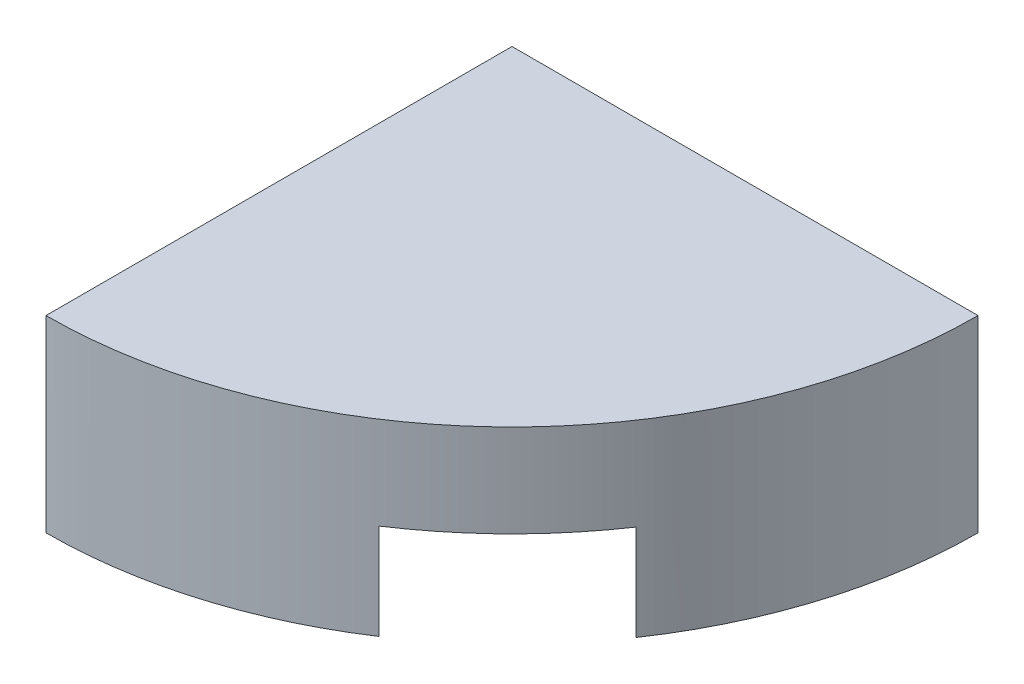
ISO-10303-21;
HEADER;
FILE_DESCRIPTION(('STEP AP214'),'2;1');
FILE_NAME('part.step','',(''),(''),'','','');
FILE_SCHEMA(('AUTOMOTIVE_DESIGN { 1 0 10303 214 1 1 1 1 }'));
ENDSEC;
DATA;
#1=APPLICATION_CONTEXT('core data for automotive mechanical design processes');
#2=APPLICATION_PROTOCOL_DEFINITION('international standard','automotive_design',2000,#1);
#3=PRODUCT_CONTEXT('',#1,'mechanical');
#4=PRODUCT('Part','Part','',(#3));
#5=PRODUCT_RELATED_PRODUCT_CATEGORY('part','',(#4));
#6=PRODUCT_DEFINITION_FORMATION('','',#4);
#7=PRODUCT_DEFINITION_CONTEXT('part definition',#1,'design');
#8=PRODUCT_DEFINITION('design','',#6,#7);
#9=PRODUCT_DEFINITION_SHAPE('','',#8);
#10=(LENGTH_UNIT() NAMED_UNIT(*) SI_UNIT(.MILLI.,.METRE.));
#11=(NAMED_UNIT(*) PLANE_ANGLE_UNIT() SI_UNIT($,.RADIAN.));
#12=(NAMED_UNIT(*) SI_UNIT($,.STERADIAN.) SOLID_ANGLE_UNIT());
#13=UNCERTAINTY_MEASURE_WITH_UNIT(LENGTH_MEASURE(1.E-05),#10,'distance_accuracy_value','');
#14=(GEOMETRIC_REPRESENTATION_CONTEXT(3) GLOBAL_UNCERTAINTY_ASSIGNED_CONTEXT((#13)) GLOBAL_UNIT_ASSIGNED_CONTEXT((#10,
#11,#12)) REPRESENTATION_CONTEXT('',''));
#15=CARTESIAN_POINT('',(0.,0.,0.));
#16=DIRECTION('',(0.,0.,1.));
#17=DIRECTION('',(1.,0.,0.));
#18=AXIS2_PLACEMENT_3D('',#15,#16,#17);
#19=CARTESIAN_POINT('',(0.,-3.15,0.));
#20=DIRECTION('',(0.,1.,0.));
#21=DIRECTION('',(0.,0.,1.));
#22=AXIS2_PLACEMENT_3D('',#19,#20,#21);
#23=CYLINDRICAL_SURFACE('',#22,7.8);
#24=CARTESIAN_POINT('',(0.,-1.55,0.));
#25=DIRECTION('',(0.,-1.,0.));
#26=DIRECTION('',(0.,0.,-1.));
#27=AXIS2_PLACEMENT_3D('',#24,#25,#26);
#28=CIRCLE('',#27,7.8);
#29=CARTESIAN_POINT('',(4.28874587097361,-1.55,6.51511004160381));
#30=VERTEX_POINT('',#29);
#31=CARTESIAN_POINT('',(6.45391788949066,-1.55,4.38029038714472));
#32=VERTEX_POINT('',#31);
#33=EDGE_CURVE('E183',#30,#32,#28,.F.);
#34=ORIENTED_EDGE('',*,*,#33,.T.);
#35=DIRECTION('',(0.,1.,0.));
#36=VECTOR('',#35,1.);
#37=CARTESIAN_POINT('',(6.45391788949066,-2.35,4.38029038714472));
#38=LINE('',#37,#36);
#39=CARTESIAN_POINT('',(6.45391788949066,-3.15,4.38029038714472));
#40=VERTEX_POINT('',#39);
#41=EDGE_CURVE('E116',#32,#40,#38,.F.);
#42=ORIENTED_EDGE('',*,*,#41,.T.);
#43=CARTESIAN_POINT('',(0.,-3.15,0.));
#44=DIRECTION('',(0.,1.,0.));
#45=DIRECTION('',(0.,0.,1.));
#46=AXIS2_PLACEMENT_3D('',#43,#44,#45);
#47=CIRCLE('',#46,7.8);
#48=CARTESIAN_POINT('',(7.8,-3.15,0.));
#49=VERTEX_POINT('',#48);
#50=EDGE_CURVE('E131',#40,#49,#47,.T.);
#51=ORIENTED_EDGE('',*,*,#50,.T.);
#52=DIRECTION('',(0.,1.,0.));
#53=VECTOR('',#52,1.);
#54=CARTESIAN_POINT('',(7.8,-3.15,0.));
#55=LINE('',#54,#53);
#56=CARTESIAN_POINT('',(7.8,0.,0.));
#57=VERTEX_POINT('',#56);
#58=EDGE_CURVE('E11',#49,#57,#55,.T.);
#59=ORIENTED_EDGE('',*,*,#58,.T.);
#60=CARTESIAN_POINT('',(0.,0.,0.));
#61=DIRECTION('',(0.,1.,0.));
#62=DIRECTION('',(0.,0.,1.));
#63=AXIS2_PLACEMENT_3D('',#60,#61,#62);
#64=CIRCLE('',#63,7.8);
#65=CARTESIAN_POINT('',(0.,0.,7.8));
#66=VERTEX_POINT('',#65);
#67=EDGE_CURVE('E144',#66,#57,#64,.T.);
#68=ORIENTED_EDGE('',*,*,#67,.F.);
#69=DIRECTION('',(0.,1.,0.));
#70=VECTOR('',#69,1.);
#71=CARTESIAN_POINT('',(0.,-3.15,7.8));
#72=LINE('',#71,#70);
#73=CARTESIAN_POINT('',(0.,-3.15,7.8));
#74=VERTEX_POINT('',#73);
#75=EDGE_CURVE('E41',#74,#66,#72,.T.);
#76=ORIENTED_EDGE('',*,*,#75,.F.);
#77=CARTESIAN_POINT('',(4.28874587097361,-3.15,6.51511004160381));
#78=VERTEX_POINT('',#77);
#79=EDGE_CURVE('E124',#74,#78,#47,.T.);
#80=ORIENTED_EDGE('',*,*,#79,.T.);
#81=DIRECTION('',(0.,1.,0.));
#82=VECTOR('',#81,1.);
#83=CARTESIAN_POINT('',(4.28874587097361,-2.35,6.51511004160381));
#84=LINE('',#83,#82);
#85=EDGE_CURVE('E109',#78,#30,#84,.T.);
#86=ORIENTED_EDGE('',*,*,#85,.T.);
#87=EDGE_LOOP('',(#34,#42,#51,#59,#68,#76,#80,#86));
#88=FACE_BOUND('',#87,.T.);
#89=ADVANCED_FACE('F32',(#88),#23,.T.);
#90=CARTESIAN_POINT('',(0.,-3.15,0.));
#91=DIRECTION('',(0.,1.,0.));
#92=DIRECTION('',(0.,0.,1.));
#93=AXIS2_PLACEMENT_3D('',#90,#91,#92);
#94=CYLINDRICAL_SURFACE('',#93,6.25);
#95=DIRECTION('',(0.,1.,0.));
#96=VECTOR('',#95,1.);
#97=CARTESIAN_POINT('',(5.77754422940284,-2.35,2.38379585478579));
#98=LINE('',#97,#96);
#99=CARTESIAN_POINT('',(5.77754422940284,-1.55,2.38379585478579));
#100=VERTEX_POINT('',#99);
#101=CARTESIAN_POINT('',(5.77754422940284,-3.15,2.38379585478579));
#102=VERTEX_POINT('',#101);
#103=EDGE_CURVE('E117',#100,#102,#98,.F.);
#104=ORIENTED_EDGE('',*,*,#103,.F.);
#105=CARTESIAN_POINT('',(0.,-1.55,0.));
#106=DIRECTION('',(0.,1.,0.));
#107=DIRECTION('',(0.,0.,1.));
#108=AXIS2_PLACEMENT_3D('',#105,#106,#107);
#109=CIRCLE('',#108,6.25);
#110=CARTESIAN_POINT('',(6.05475020128824,-1.55,1.55));
#111=VERTEX_POINT('',#110);
#112=EDGE_CURVE('E172',#100,#111,#109,.T.);
#113=ORIENTED_EDGE('',*,*,#112,.T.);
#114=DIRECTION('',(0.,1.,0.));
#115=VECTOR('',#114,1.);
#116=CARTESIAN_POINT('',(6.05475020128824,-3.15,1.55));
#117=LINE('',#116,#115);
#118=CARTESIAN_POINT('',(6.05475020128824,-3.15,1.55));
#119=VERTEX_POINT('',#118);
#120=EDGE_CURVE('E141',#119,#111,#117,.T.);
#121=ORIENTED_EDGE('',*,*,#120,.F.);
#122=CARTESIAN_POINT('',(0.,-3.15,0.));
#123=DIRECTION('',(0.,1.,0.));
#124=DIRECTION('',(0.,0.,1.));
#125=AXIS2_PLACEMENT_3D('',#122,#123,#124);
#126=CIRCLE('',#125,6.25);
#127=EDGE_CURVE('E162',#102,#119,#126,.T.);
#128=ORIENTED_EDGE('',*,*,#127,.F.);
#129=EDGE_LOOP('',(#104,#113,#121,#128));
#130=FACE_BOUND('',#129,.T.);
#131=ADVANCED_FACE('F207',(#130),#94,.F.);
#132=DIRECTION('',(0.,1.,0.));
#133=VECTOR('',#132,1.);
#134=CARTESIAN_POINT('',(2.30199844633871,-2.35,5.81061985962377));
#135=LINE('',#134,#133);
#136=CARTESIAN_POINT('',(2.30199844633871,-3.15,5.81061985962377));
#137=VERTEX_POINT('',#136);
#138=CARTESIAN_POINT('',(2.30199844633871,-1.55,5.81061985962377));
#139=VERTEX_POINT('',#138);
#140=EDGE_CURVE('E187',#137,#139,#135,.T.);
#141=ORIENTED_EDGE('',*,*,#140,.F.);
#142=CARTESIAN_POINT('',(1.55,-3.15,6.05475020128824));
#143=VERTEX_POINT('',#142);
#144=EDGE_CURVE('E56',#143,#137,#126,.T.);
#145=ORIENTED_EDGE('',*,*,#144,.F.);
#146=DIRECTION('',(0.,1.,0.));
#147=VECTOR('',#146,1.);
#148=CARTESIAN_POINT('',(1.55,-3.15,6.05475020128824));
#149=LINE('',#148,#147);
#150=CARTESIAN_POINT('',(1.55,-1.55,6.05475020128824));
#151=VERTEX_POINT('',#150);
#152=EDGE_CURVE('E174',#143,#151,#149,.T.);
#153=ORIENTED_EDGE('',*,*,#152,.T.);
#154=EDGE_CURVE('E168',#151,#139,#109,.T.);
#155=ORIENTED_EDGE('',*,*,#154,.T.);
#156=EDGE_LOOP('',(#141,#145,#153,#155));
#157=FACE_BOUND('',#156,.T.);
#158=ADVANCED_FACE('F195',(#157),#94,.F.);
#159=CARTESIAN_POINT('',(0.,-3.15,0.));
#160=DIRECTION('',(0.,0.,-1.));
#161=DIRECTION('',(-1.,0.,0.));
#162=AXIS2_PLACEMENT_3D('',#159,#160,#161);
#163=PLANE('',#162);
#164=DIRECTION('',(-1.,0.,0.));
#165=VECTOR('',#164,1.);
#166=CARTESIAN_POINT('',(0.,0.,0.));
#167=LINE('',#166,#165);
#168=CARTESIAN_POINT('',(0.,0.,0.));
#169=VERTEX_POINT('',#168);
#170=EDGE_CURVE('E137',#57,#169,#167,.T.);
#171=ORIENTED_EDGE('',*,*,#170,.F.);
#172=ORIENTED_EDGE('',*,*,#58,.F.);
#173=DIRECTION('',(-1.,0.,0.));
#174=VECTOR('',#173,1.);
#175=CARTESIAN_POINT('',(0.,-3.15,0.));
#176=LINE('',#175,#174);
#177=CARTESIAN_POINT('',(0.,-3.15,0.));
#178=VERTEX_POINT('',#177);
#179=EDGE_CURVE('E146',#49,#178,#176,.T.);
#180=ORIENTED_EDGE('',*,*,#179,.T.);
#181=DIRECTION('',(0.,1.,0.));
#182=VECTOR('',#181,1.);
#183=CARTESIAN_POINT('',(0.,-3.15,0.));
#184=LINE('',#183,#182);
#185=EDGE_CURVE('E36',#178,#169,#184,.T.);
#186=ORIENTED_EDGE('',*,*,#185,.T.);
#187=EDGE_LOOP('',(#171,#172,#180,#186));
#188=FACE_BOUND('',#187,.T.);
#189=ADVANCED_FACE('F34',(#188),#163,.T.);
#190=CARTESIAN_POINT('',(0.,-3.15,0.));
#191=DIRECTION('',(-1.,0.,0.));
#192=DIRECTION('',(0.,0.,1.));
#193=AXIS2_PLACEMENT_3D('',#190,#191,#192);
#194=PLANE('',#193);
#195=DIRECTION('',(0.,0.,1.));
#196=VECTOR('',#195,1.);
#197=CARTESIAN_POINT('',(0.,0.,0.));
#198=LINE('',#197,#196);
#199=EDGE_CURVE('E140',#169,#66,#198,.T.);
#200=ORIENTED_EDGE('',*,*,#199,.F.);
#201=ORIENTED_EDGE('',*,*,#185,.F.);
#202=DIRECTION('',(0.,0.,1.));
#203=VECTOR('',#202,1.);
#204=CARTESIAN_POINT('',(0.,-3.15,0.));
#205=LINE('',#204,#203);
#206=EDGE_CURVE('E133',#178,#74,#205,.T.);
#207=ORIENTED_EDGE('',*,*,#206,.T.);
#208=ORIENTED_EDGE('',*,*,#75,.T.);
#209=EDGE_LOOP('',(#200,#201,#207,#208));
#210=FACE_BOUND('',#209,.T.);
#211=ADVANCED_FACE('F149',(#210),#194,.T.);
#212=CARTESIAN_POINT('',(0.,-3.15,0.));
#213=DIRECTION('',(0.,1.,0.));
#214=DIRECTION('',(0.,0.,1.));
#215=AXIS2_PLACEMENT_3D('',#212,#213,#214);
#216=PLANE('',#215);
#217=CARTESIAN_POINT('',(4.03099837109597,-3.15,4.08831015845045));
#218=DIRECTION('',(0.,1.,0.));
#219=DIRECTION('',(0.,0.,1.));
#220=AXIS2_PLACEMENT_3D('',#217,#218,#219);
#221=CIRCLE('',#220,2.44044902560293);
#222=EDGE_CURVE('E126',#40,#102,#221,.T.);
#223=ORIENTED_EDGE('',*,*,#222,.T.);
#224=ORIENTED_EDGE('',*,*,#127,.T.);
#225=DIRECTION('',(-1.,0.,0.));
#226=VECTOR('',#225,1.);
#227=CARTESIAN_POINT('',(0.,-3.15,1.55));
#228=LINE('',#227,#226);
#229=CARTESIAN_POINT('',(1.55,-3.15,1.55));
#230=VERTEX_POINT('',#229);
#231=EDGE_CURVE('E163',#119,#230,#228,.T.);
#232=ORIENTED_EDGE('',*,*,#231,.T.);
#233=DIRECTION('',(0.,0.,1.));
#234=VECTOR('',#233,1.);
#235=CARTESIAN_POINT('',(1.55,-3.15,0.));
#236=LINE('',#235,#234);
#237=EDGE_CURVE('E160',#230,#143,#236,.T.);
#238=ORIENTED_EDGE('',*,*,#237,.T.);
#239=ORIENTED_EDGE('',*,*,#144,.T.);
#240=EDGE_CURVE('E49',#137,#78,#221,.T.);
#241=ORIENTED_EDGE('',*,*,#240,.T.);
#242=ORIENTED_EDGE('',*,*,#79,.F.);
#243=ORIENTED_EDGE('',*,*,#206,.F.);
#244=ORIENTED_EDGE('',*,*,#179,.F.);
#245=ORIENTED_EDGE('',*,*,#50,.F.);
#246=EDGE_LOOP('',(#223,#224,#232,#238,#239,#241,#242,#243,#244,#245));
#247=FACE_BOUND('',#246,.T.);
#248=ADVANCED_FACE('F122',(#247),#216,.F.);
#249=CARTESIAN_POINT('',(0.,0.,0.));
#250=DIRECTION('',(0.,1.,0.));
#251=DIRECTION('',(0.,0.,1.));
#252=AXIS2_PLACEMENT_3D('',#249,#250,#251);
#253=PLANE('',#252);
#254=ORIENTED_EDGE('',*,*,#170,.T.);
#255=ORIENTED_EDGE('',*,*,#199,.T.);
#256=ORIENTED_EDGE('',*,*,#67,.T.);
#257=EDGE_LOOP('',(#254,#255,#256));
#258=FACE_BOUND('',#257,.T.);
#259=ADVANCED_FACE('F151',(#258),#253,.T.);
#260=CARTESIAN_POINT('',(0.,-3.15,1.55));
#261=DIRECTION('',(0.,0.,-1.));
#262=DIRECTION('',(-1.,0.,0.));
#263=AXIS2_PLACEMENT_3D('',#260,#261,#262);
#264=PLANE('',#263);
#265=DIRECTION('',(-1.,0.,0.));
#266=VECTOR('',#265,1.);
#267=CARTESIAN_POINT('',(0.,-1.55,1.55));
#268=LINE('',#267,#266);
#269=CARTESIAN_POINT('',(1.55,-1.55,1.55));
#270=VERTEX_POINT('',#269);
#271=EDGE_CURVE('E173',#111,#270,#268,.T.);
#272=ORIENTED_EDGE('',*,*,#271,.T.);
#273=DIRECTION('',(0.,1.,0.));
#274=VECTOR('',#273,1.);
#275=CARTESIAN_POINT('',(1.55,-3.15,1.55));
#276=LINE('',#275,#274);
#277=EDGE_CURVE('E165',#230,#270,#276,.T.);
#278=ORIENTED_EDGE('',*,*,#277,.F.);
#279=ORIENTED_EDGE('',*,*,#231,.F.);
#280=ORIENTED_EDGE('',*,*,#120,.T.);
#281=EDGE_LOOP('',(#272,#278,#279,#280));
#282=FACE_BOUND('',#281,.T.);
#283=ADVANCED_FACE('F201',(#282),#264,.F.);
#284=CARTESIAN_POINT('',(1.55,-3.15,0.));
#285=DIRECTION('',(-1.,0.,0.));
#286=DIRECTION('',(0.,0.,1.));
#287=AXIS2_PLACEMENT_3D('',#284,#285,#286);
#288=PLANE('',#287);
#289=DIRECTION('',(0.,0.,1.));
#290=VECTOR('',#289,1.);
#291=CARTESIAN_POINT('',(1.55,-1.55,0.));
#292=LINE('',#291,#290);
#293=EDGE_CURVE('E169',#270,#151,#292,.T.);
#294=ORIENTED_EDGE('',*,*,#293,.T.);
#295=ORIENTED_EDGE('',*,*,#152,.F.);
#296=ORIENTED_EDGE('',*,*,#237,.F.);
#297=ORIENTED_EDGE('',*,*,#277,.T.);
#298=EDGE_LOOP('',(#294,#295,#296,#297));
#299=FACE_BOUND('',#298,.T.);
#300=ADVANCED_FACE('F198',(#299),#288,.F.);
#301=CARTESIAN_POINT('',(0.,-1.55,0.));
#302=DIRECTION('',(0.,1.,0.));
#303=DIRECTION('',(0.,0.,1.));
#304=AXIS2_PLACEMENT_3D('',#301,#302,#303);
#305=PLANE('',#304);
#306=ORIENTED_EDGE('',*,*,#112,.F.);
#307=CARTESIAN_POINT('',(4.03099837109597,-1.55,4.08831015845045));
#308=DIRECTION('',(0.,-1.,0.));
#309=DIRECTION('',(0.,0.,-1.));
#310=AXIS2_PLACEMENT_3D('',#307,#308,#309);
#311=CIRCLE('',#310,2.44044902560293);
#312=EDGE_CURVE('E127',#100,#32,#311,.T.);
#313=ORIENTED_EDGE('',*,*,#312,.T.);
#314=ORIENTED_EDGE('',*,*,#33,.F.);
#315=EDGE_CURVE('E112',#30,#139,#311,.T.);
#316=ORIENTED_EDGE('',*,*,#315,.T.);
#317=ORIENTED_EDGE('',*,*,#154,.F.);
#318=ORIENTED_EDGE('',*,*,#293,.F.);
#319=ORIENTED_EDGE('',*,*,#271,.F.);
#320=EDGE_LOOP('',(#306,#313,#314,#316,#317,#318,#319));
#321=FACE_BOUND('',#320,.T.);
#322=ADVANCED_FACE('F193',(#321),#305,.F.);
#323=CARTESIAN_POINT('',(4.03099837109597,-10.0526322205757,4.08831015845045));
#324=DIRECTION('',(0.,1.,0.));
#325=DIRECTION('',(0.,0.,1.));
#326=AXIS2_PLACEMENT_3D('',#323,#324,#325);
#327=CYLINDRICAL_SURFACE('',#326,2.44044902560293);
#328=ORIENTED_EDGE('',*,*,#312,.F.);
#329=ORIENTED_EDGE('',*,*,#103,.T.);
#330=ORIENTED_EDGE('',*,*,#222,.F.);
#331=ORIENTED_EDGE('',*,*,#41,.F.);
#332=EDGE_LOOP('',(#328,#329,#330,#331));
#333=FACE_BOUND('',#332,.T.);
#334=ADVANCED_FACE('F209',(#333),#327,.F.);
#335=ORIENTED_EDGE('',*,*,#240,.F.);
#336=ORIENTED_EDGE('',*,*,#140,.T.);
#337=ORIENTED_EDGE('',*,*,#315,.F.);
#338=ORIENTED_EDGE('',*,*,#85,.F.);
#339=EDGE_LOOP('',(#335,#336,#337,#338));
#340=FACE_BOUND('',#339,.T.);
#341=ADVANCED_FACE('F110',(#340),#327,.F.);
#342=CLOSED_SHELL('',(#89,#131,#158,#189,#211,#248,#259,#283,#300,#322,#334,#341));
#343=MANIFOLD_SOLID_BREP('B2',#342);
#344=ADVANCED_BREP_SHAPE_REPRESENTATION('',(#18,#343),#14);
#345=SHAPE_DEFINITION_REPRESENTATION(#9,#344);
ENDSEC;
END-ISO-10303-21;
